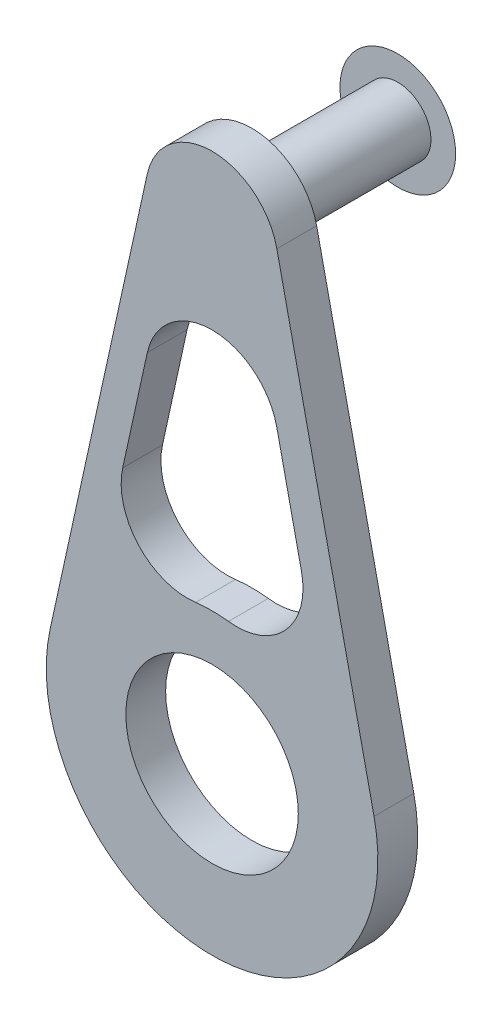
ISO-10303-21;
HEADER;
FILE_DESCRIPTION(('STEP AP214'),'2;1');
FILE_NAME('part.step','',(''),(''),'','','');
FILE_SCHEMA(('AUTOMOTIVE_DESIGN { 1 0 10303 214 1 1 1 1 }'));
ENDSEC;
DATA;
#1=APPLICATION_CONTEXT('core data for automotive mechanical design processes');
#2=APPLICATION_PROTOCOL_DEFINITION('international standard','automotive_design',2000,#1);
#3=PRODUCT_CONTEXT('',#1,'mechanical');
#4=PRODUCT('Part','Part','',(#3));
#5=PRODUCT_RELATED_PRODUCT_CATEGORY('part','',(#4));
#6=PRODUCT_DEFINITION_FORMATION('','',#4);
#7=PRODUCT_DEFINITION_CONTEXT('part definition',#1,'design');
#8=PRODUCT_DEFINITION('design','',#6,#7);
#9=PRODUCT_DEFINITION_SHAPE('','',#8);
#10=(LENGTH_UNIT() NAMED_UNIT(*) SI_UNIT(.MILLI.,.METRE.));
#11=(NAMED_UNIT(*) PLANE_ANGLE_UNIT() SI_UNIT($,.RADIAN.));
#12=(NAMED_UNIT(*) SI_UNIT($,.STERADIAN.) SOLID_ANGLE_UNIT());
#13=UNCERTAINTY_MEASURE_WITH_UNIT(LENGTH_MEASURE(1.E-05),#10,'distance_accuracy_value','');
#14=(GEOMETRIC_REPRESENTATION_CONTEXT(3) GLOBAL_UNCERTAINTY_ASSIGNED_CONTEXT((#13)) GLOBAL_UNIT_ASSIGNED_CONTEXT((#10,
#11,#12)) REPRESENTATION_CONTEXT('',''));
#15=CARTESIAN_POINT('',(0.,0.,0.));
#16=DIRECTION('',(0.,0.,1.));
#17=DIRECTION('',(1.,0.,0.));
#18=AXIS2_PLACEMENT_3D('',#15,#16,#17);
#19=CARTESIAN_POINT('',(0.,0.,11.));
#20=DIRECTION('',(0.,0.,-1.));
#21=DIRECTION('',(-1.,0.,0.));
#22=AXIS2_PLACEMENT_3D('',#19,#20,#21);
#23=CYLINDRICAL_SURFACE('',#22,2.5);
#24=CARTESIAN_POINT('',(0.,0.,11.));
#25=DIRECTION('',(0.,0.,1.));
#26=DIRECTION('',(1.,0.,0.));
#27=AXIS2_PLACEMENT_3D('',#24,#25,#26);
#28=CIRCLE('',#27,2.5);
#29=CARTESIAN_POINT('',(2.5,0.,11.));
#30=VERTEX_POINT('',#29);
#31=EDGE_CURVE('E188',#30,#30,#28,.T.);
#32=ORIENTED_EDGE('',*,*,#31,.F.);
#33=EDGE_LOOP('',(#32));
#34=FACE_BOUND('',#33,.T.);
#35=CARTESIAN_POINT('',(0.,0.,0.));
#36=DIRECTION('',(0.,0.,-1.));
#37=DIRECTION('',(-1.,0.,0.));
#38=AXIS2_PLACEMENT_3D('',#35,#36,#37);
#39=CIRCLE('',#38,2.5);
#40=CARTESIAN_POINT('',(-2.5,0.,0.));
#41=VERTEX_POINT('',#40);
#42=EDGE_CURVE('E185',#41,#41,#39,.T.);
#43=ORIENTED_EDGE('',*,*,#42,.F.);
#44=EDGE_LOOP('',(#43));
#45=FACE_BOUND('',#44,.T.);
#46=ADVANCED_FACE('F41',(#34,#45),#23,.T.);
#47=CARTESIAN_POINT('',(0.,0.,9.));
#48=DIRECTION('',(0.,0.,1.));
#49=DIRECTION('',(1.,0.,0.));
#50=AXIS2_PLACEMENT_3D('',#47,#48,#49);
#51=SPHERICAL_SURFACE('',#50,10.);
#52=CARTESIAN_POINT('',(0.,0.,0.));
#53=DIRECTION('',(0.,0.,1.));
#54=DIRECTION('',(1.,0.,0.));
#55=AXIS2_PLACEMENT_3D('',#52,#53,#54);
#56=CIRCLE('',#55,4.35889894354068);
#57=CARTESIAN_POINT('',(4.35889894354068,0.,0.));
#58=VERTEX_POINT('',#57);
#59=EDGE_CURVE('E182',#58,#58,#56,.T.);
#60=ORIENTED_EDGE('',*,*,#59,.F.);
#61=EDGE_LOOP('',(#60));
#62=FACE_BOUND('',#61,.T.);
#63=ADVANCED_FACE('F239',(#62),#51,.T.);
#64=CARTESIAN_POINT('',(0.,0.,0.));
#65=DIRECTION('',(0.,0.,-1.));
#66=DIRECTION('',(-1.,0.,0.));
#67=AXIS2_PLACEMENT_3D('',#64,#65,#66);
#68=PLANE('',#67);
#69=ORIENTED_EDGE('',*,*,#42,.T.);
#70=EDGE_LOOP('',(#69));
#71=FACE_BOUND('',#70,.T.);
#72=ORIENTED_EDGE('',*,*,#59,.T.);
#73=EDGE_LOOP('',(#72));
#74=FACE_BOUND('',#73,.T.);
#75=ADVANCED_FACE('F228',(#71,#74),#68,.F.);
#76=CARTESIAN_POINT('',(0.,0.,14.));
#77=DIRECTION('',(0.,0.,1.));
#78=DIRECTION('',(1.,0.,0.));
#79=AXIS2_PLACEMENT_3D('',#76,#77,#78);
#80=PLANE('',#79);
#81=CARTESIAN_POINT('',(0.,0.,14.));
#82=DIRECTION('',(0.,0.,1.));
#83=DIRECTION('',(1.,0.,0.));
#84=AXIS2_PLACEMENT_3D('',#81,#82,#83);
#85=CIRCLE('',#84,4.99999999999999);
#86=CARTESIAN_POINT('',(4.88385511827761,1.07142857142857,14.));
#87=VERTEX_POINT('',#86);
#88=CARTESIAN_POINT('',(-4.88385511827762,1.07142857142857,14.));
#89=VERTEX_POINT('',#88);
#90=EDGE_CURVE('E153',#87,#89,#85,.T.);
#91=ORIENTED_EDGE('',*,*,#90,.T.);
#92=DIRECTION('',(-0.214285714285714,-0.976771023655524,0.));
#93=VECTOR('',#92,1.);
#94=CARTESIAN_POINT('',(-4.88385511827762,1.07142857142857,14.));
#95=LINE('',#94,#93);
#96=CARTESIAN_POINT('',(-12.2096377956941,-32.3214285714286,14.));
#97=VERTEX_POINT('',#96);
#98=EDGE_CURVE('E156',#89,#97,#95,.T.);
#99=ORIENTED_EDGE('',*,*,#98,.T.);
#100=CARTESIAN_POINT('',(0.,-34.9999999999983,14.));
#101=DIRECTION('',(0.,0.,1.));
#102=DIRECTION('',(1.,0.,0.));
#103=AXIS2_PLACEMENT_3D('',#100,#101,#102);
#104=CIRCLE('',#103,12.4999999999997);
#105=CARTESIAN_POINT('',(12.2096377956942,-32.3214285714286,14.));
#106=VERTEX_POINT('',#105);
#107=EDGE_CURVE('E159',#97,#106,#104,.T.);
#108=ORIENTED_EDGE('',*,*,#107,.T.);
#109=DIRECTION('',(-0.214285714285721,0.976771023655523,0.));
#110=VECTOR('',#109,1.);
#111=CARTESIAN_POINT('',(4.88385511827761,1.07142857142857,14.));
#112=LINE('',#111,#110);
#113=EDGE_CURVE('E161',#106,#87,#112,.T.);
#114=ORIENTED_EDGE('',*,*,#113,.T.);
#115=EDGE_LOOP('',(#91,#99,#108,#114));
#116=FACE_BOUND('',#115,.T.);
#117=DIRECTION('',(-0.21428571428572,0.976771023655523,0.));
#118=VECTOR('',#117,1.);
#119=CARTESIAN_POINT('',(9.76771023655547,-32.8571428571429,14.));
#120=LINE('',#119,#118);
#121=CARTESIAN_POINT('',(6.73725260289842,-19.0435145672744,14.));
#122=VERTEX_POINT('',#121);
#123=CARTESIAN_POINT('',(4.88385511827767,-10.5952380952381,14.));
#124=VERTEX_POINT('',#123);
#125=EDGE_CURVE('E118',#122,#124,#120,.T.);
#126=ORIENTED_EDGE('',*,*,#125,.F.);
#127=CARTESIAN_POINT('',(1.8533974846208,-20.114943138703,14.));
#128=DIRECTION('',(0.,0.,1.));
#129=DIRECTION('',(1.,0.,0.));
#130=AXIS2_PLACEMENT_3D('',#127,#128,#129);
#131=CIRCLE('',#130,5.);
#132=CARTESIAN_POINT('',(1.23559832308054,-25.0766287591349,14.));
#133=VERTEX_POINT('',#132);
#134=EDGE_CURVE('E201',#122,#133,#131,.F.);
#135=ORIENTED_EDGE('',*,*,#134,.T.);
#136=CARTESIAN_POINT('',(0.,-34.9999999999983,14.));
#137=DIRECTION('',(0.,0.,1.));
#138=DIRECTION('',(1.,0.,0.));
#139=AXIS2_PLACEMENT_3D('',#136,#137,#138);
#140=CIRCLE('',#139,9.99999999999974);
#141=CARTESIAN_POINT('',(-1.23559832308041,-25.0766287591349,14.));
#142=VERTEX_POINT('',#141);
#143=EDGE_CURVE('E218',#133,#142,#140,.T.);
#144=ORIENTED_EDGE('',*,*,#143,.T.);
#145=CARTESIAN_POINT('',(-1.85339748462067,-20.114943138703,14.));
#146=DIRECTION('',(0.,0.,1.));
#147=DIRECTION('',(1.,0.,0.));
#148=AXIS2_PLACEMENT_3D('',#145,#146,#147);
#149=CIRCLE('',#148,5.);
#150=CARTESIAN_POINT('',(-6.73725260289829,-19.0435145672744,14.));
#151=VERTEX_POINT('',#150);
#152=EDGE_CURVE('E11',#142,#151,#149,.F.);
#153=ORIENTED_EDGE('',*,*,#152,.T.);
#154=DIRECTION('',(-0.214285714285714,-0.976771023655525,0.));
#155=VECTOR('',#154,1.);
#156=CARTESIAN_POINT('',(-9.76771023655524,-32.8571428571429,14.));
#157=LINE('',#156,#155);
#158=CARTESIAN_POINT('',(-4.88385511827764,-10.5952380952381,14.));
#159=VERTEX_POINT('',#158);
#160=EDGE_CURVE('E141',#159,#151,#157,.T.);
#161=ORIENTED_EDGE('',*,*,#160,.F.);
#162=CARTESIAN_POINT('',(0.,-11.6666666666667,14.));
#163=DIRECTION('',(0.,0.,1.));
#164=DIRECTION('',(1.,0.,0.));
#165=AXIS2_PLACEMENT_3D('',#162,#163,#164);
#166=CIRCLE('',#165,5.00000000000005);
#167=EDGE_CURVE('E128',#124,#159,#166,.T.);
#168=ORIENTED_EDGE('',*,*,#167,.F.);
#169=EDGE_LOOP('',(#126,#135,#144,#153,#161,#168));
#170=FACE_BOUND('',#169,.T.);
#171=CARTESIAN_POINT('',(0.,-34.9999999999983,14.));
#172=DIRECTION('',(0.,0.,1.));
#173=DIRECTION('',(1.,0.,0.));
#174=AXIS2_PLACEMENT_3D('',#171,#172,#173);
#175=CIRCLE('',#174,6.5);
#176=CARTESIAN_POINT('',(6.50000000000006,-34.9999999999983,14.));
#177=VERTEX_POINT('',#176);
#178=EDGE_CURVE('E219',#177,#177,#175,.T.);
#179=ORIENTED_EDGE('',*,*,#178,.F.);
#180=EDGE_LOOP('',(#179));
#181=FACE_BOUND('',#180,.T.);
#182=ADVANCED_FACE('F139',(#116,#170,#181),#80,.T.);
#183=CARTESIAN_POINT('',(0.,0.,11.));
#184=DIRECTION('',(0.,0.,1.));
#185=DIRECTION('',(1.,0.,0.));
#186=AXIS2_PLACEMENT_3D('',#183,#184,#185);
#187=PLANE('',#186);
#188=ORIENTED_EDGE('',*,*,#31,.T.);
#189=EDGE_LOOP('',(#188));
#190=FACE_BOUND('',#189,.T.);
#191=CARTESIAN_POINT('',(0.,0.,11.));
#192=DIRECTION('',(0.,0.,1.));
#193=DIRECTION('',(1.,0.,0.));
#194=AXIS2_PLACEMENT_3D('',#191,#192,#193);
#195=CIRCLE('',#194,4.99999999999999);
#196=CARTESIAN_POINT('',(4.88385511827761,1.07142857142857,11.));
#197=VERTEX_POINT('',#196);
#198=CARTESIAN_POINT('',(-4.88385511827762,1.07142857142857,11.));
#199=VERTEX_POINT('',#198);
#200=EDGE_CURVE('E136',#197,#199,#195,.T.);
#201=ORIENTED_EDGE('',*,*,#200,.F.);
#202=DIRECTION('',(-0.214285714285721,0.976771023655523,0.));
#203=VECTOR('',#202,1.);
#204=CARTESIAN_POINT('',(4.88385511827761,1.07142857142857,11.));
#205=LINE('',#204,#203);
#206=CARTESIAN_POINT('',(12.2096377956942,-32.3214285714286,11.));
#207=VERTEX_POINT('',#206);
#208=EDGE_CURVE('E157',#207,#197,#205,.T.);
#209=ORIENTED_EDGE('',*,*,#208,.F.);
#210=CARTESIAN_POINT('',(0.,-34.9999999999983,11.));
#211=DIRECTION('',(0.,0.,1.));
#212=DIRECTION('',(1.,0.,0.));
#213=AXIS2_PLACEMENT_3D('',#210,#211,#212);
#214=CIRCLE('',#213,12.4999999999997);
#215=CARTESIAN_POINT('',(-12.2096377956941,-32.3214285714286,11.));
#216=VERTEX_POINT('',#215);
#217=EDGE_CURVE('E168',#216,#207,#214,.T.);
#218=ORIENTED_EDGE('',*,*,#217,.F.);
#219=DIRECTION('',(-0.214285714285714,-0.976771023655524,0.));
#220=VECTOR('',#219,1.);
#221=CARTESIAN_POINT('',(-4.88385511827762,1.07142857142857,11.));
#222=LINE('',#221,#220);
#223=EDGE_CURVE('E166',#199,#216,#222,.T.);
#224=ORIENTED_EDGE('',*,*,#223,.F.);
#225=EDGE_LOOP('',(#201,#209,#218,#224));
#226=FACE_BOUND('',#225,.T.);
#227=DIRECTION('',(-0.214285714285714,-0.976771023655525,0.));
#228=VECTOR('',#227,1.);
#229=CARTESIAN_POINT('',(-9.76771023655524,-32.8571428571429,11.));
#230=LINE('',#229,#228);
#231=CARTESIAN_POINT('',(-4.88385511827764,-10.5952380952381,11.));
#232=VERTEX_POINT('',#231);
#233=CARTESIAN_POINT('',(-6.73725260289829,-19.0435145672744,11.));
#234=VERTEX_POINT('',#233);
#235=EDGE_CURVE('E129',#232,#234,#230,.T.);
#236=ORIENTED_EDGE('',*,*,#235,.T.);
#237=CARTESIAN_POINT('',(-1.85339748462067,-20.114943138703,11.));
#238=DIRECTION('',(0.,0.,1.));
#239=DIRECTION('',(1.,0.,0.));
#240=AXIS2_PLACEMENT_3D('',#237,#238,#239);
#241=CIRCLE('',#240,5.);
#242=CARTESIAN_POINT('',(-1.23559832308041,-25.0766287591349,11.));
#243=VERTEX_POINT('',#242);
#244=EDGE_CURVE('E49',#234,#243,#241,.T.);
#245=ORIENTED_EDGE('',*,*,#244,.T.);
#246=CARTESIAN_POINT('',(0.,-34.9999999999983,11.));
#247=DIRECTION('',(0.,0.,1.));
#248=DIRECTION('',(1.,0.,0.));
#249=AXIS2_PLACEMENT_3D('',#246,#247,#248);
#250=CIRCLE('',#249,9.99999999999974);
#251=CARTESIAN_POINT('',(1.23559832308054,-25.0766287591349,11.));
#252=VERTEX_POINT('',#251);
#253=EDGE_CURVE('E148',#243,#252,#250,.F.);
#254=ORIENTED_EDGE('',*,*,#253,.T.);
#255=CARTESIAN_POINT('',(1.8533974846208,-20.114943138703,11.));
#256=DIRECTION('',(0.,0.,1.));
#257=DIRECTION('',(1.,0.,0.));
#258=AXIS2_PLACEMENT_3D('',#255,#256,#257);
#259=CIRCLE('',#258,5.);
#260=CARTESIAN_POINT('',(6.73725260289842,-19.0435145672744,11.));
#261=VERTEX_POINT('',#260);
#262=EDGE_CURVE('E199',#252,#261,#259,.T.);
#263=ORIENTED_EDGE('',*,*,#262,.T.);
#264=DIRECTION('',(-0.21428571428572,0.976771023655523,0.));
#265=VECTOR('',#264,1.);
#266=CARTESIAN_POINT('',(9.76771023655547,-32.8571428571429,11.));
#267=LINE('',#266,#265);
#268=CARTESIAN_POINT('',(4.88385511827767,-10.5952380952381,11.));
#269=VERTEX_POINT('',#268);
#270=EDGE_CURVE('E146',#261,#269,#267,.T.);
#271=ORIENTED_EDGE('',*,*,#270,.T.);
#272=CARTESIAN_POINT('',(0.,-11.6666666666667,11.));
#273=DIRECTION('',(0.,0.,1.));
#274=DIRECTION('',(1.,0.,0.));
#275=AXIS2_PLACEMENT_3D('',#272,#273,#274);
#276=CIRCLE('',#275,5.00000000000005);
#277=EDGE_CURVE('E135',#269,#232,#276,.T.);
#278=ORIENTED_EDGE('',*,*,#277,.T.);
#279=EDGE_LOOP('',(#236,#245,#254,#263,#271,#278));
#280=FACE_BOUND('',#279,.T.);
#281=CARTESIAN_POINT('',(0.,-34.9999999999983,11.));
#282=DIRECTION('',(0.,0.,1.));
#283=DIRECTION('',(1.,0.,0.));
#284=AXIS2_PLACEMENT_3D('',#281,#282,#283);
#285=CIRCLE('',#284,6.5);
#286=CARTESIAN_POINT('',(6.50000000000006,-34.9999999999983,11.));
#287=VERTEX_POINT('',#286);
#288=EDGE_CURVE('E212',#287,#287,#285,.F.);
#289=ORIENTED_EDGE('',*,*,#288,.F.);
#290=EDGE_LOOP('',(#289));
#291=FACE_BOUND('',#290,.T.);
#292=ADVANCED_FACE('F205',(#190,#226,#280,#291),#187,.F.);
#293=CARTESIAN_POINT('',(0.,0.,14.));
#294=DIRECTION('',(0.,0.,-1.));
#295=DIRECTION('',(-1.,0.,0.));
#296=AXIS2_PLACEMENT_3D('',#293,#294,#295);
#297=CYLINDRICAL_SURFACE('',#296,4.99999999999999);
#298=ORIENTED_EDGE('',*,*,#200,.T.);
#299=DIRECTION('',(0.,0.,-1.));
#300=VECTOR('',#299,1.);
#301=CARTESIAN_POINT('',(-4.88385511827762,1.07142857142857,14.));
#302=LINE('',#301,#300);
#303=EDGE_CURVE('E179',#89,#199,#302,.T.);
#304=ORIENTED_EDGE('',*,*,#303,.F.);
#305=ORIENTED_EDGE('',*,*,#90,.F.);
#306=DIRECTION('',(0.,0.,-1.));
#307=VECTOR('',#306,1.);
#308=CARTESIAN_POINT('',(4.88385511827761,1.07142857142857,14.));
#309=LINE('',#308,#307);
#310=EDGE_CURVE('E163',#87,#197,#309,.T.);
#311=ORIENTED_EDGE('',*,*,#310,.T.);
#312=EDGE_LOOP('',(#298,#304,#305,#311));
#313=FACE_BOUND('',#312,.T.);
#314=ADVANCED_FACE('F235',(#313),#297,.T.);
#315=CARTESIAN_POINT('',(-4.88385511827762,1.07142857142857,14.));
#316=DIRECTION('',(0.976771023655524,-0.214285714285714,0.));
#317=DIRECTION('',(0.214285714285714,0.976771023655525,0.));
#318=AXIS2_PLACEMENT_3D('',#315,#316,#317);
#319=PLANE('',#318);
#320=ORIENTED_EDGE('',*,*,#223,.T.);
#321=DIRECTION('',(0.,0.,-1.));
#322=VECTOR('',#321,1.);
#323=CARTESIAN_POINT('',(-12.2096377956941,-32.3214285714286,14.));
#324=LINE('',#323,#322);
#325=EDGE_CURVE('E176',#97,#216,#324,.T.);
#326=ORIENTED_EDGE('',*,*,#325,.F.);
#327=ORIENTED_EDGE('',*,*,#98,.F.);
#328=ORIENTED_EDGE('',*,*,#303,.T.);
#329=EDGE_LOOP('',(#320,#326,#327,#328));
#330=FACE_BOUND('',#329,.T.);
#331=ADVANCED_FACE('F280',(#330),#319,.F.);
#332=CARTESIAN_POINT('',(0.,-34.9999999999983,14.));
#333=DIRECTION('',(0.,0.,-1.));
#334=DIRECTION('',(-1.,0.,0.));
#335=AXIS2_PLACEMENT_3D('',#332,#333,#334);
#336=CYLINDRICAL_SURFACE('',#335,12.4999999999997);
#337=ORIENTED_EDGE('',*,*,#217,.T.);
#338=DIRECTION('',(0.,0.,-1.));
#339=VECTOR('',#338,1.);
#340=CARTESIAN_POINT('',(12.2096377956942,-32.3214285714286,14.));
#341=LINE('',#340,#339);
#342=EDGE_CURVE('E173',#106,#207,#341,.T.);
#343=ORIENTED_EDGE('',*,*,#342,.F.);
#344=ORIENTED_EDGE('',*,*,#107,.F.);
#345=ORIENTED_EDGE('',*,*,#325,.T.);
#346=EDGE_LOOP('',(#337,#343,#344,#345));
#347=FACE_BOUND('',#346,.T.);
#348=ADVANCED_FACE('F274',(#347),#336,.T.);
#349=CARTESIAN_POINT('',(4.88385511827761,1.07142857142857,14.));
#350=DIRECTION('',(-0.976771023655523,-0.214285714285721,0.));
#351=DIRECTION('',(0.214285714285721,-0.976771023655523,0.));
#352=AXIS2_PLACEMENT_3D('',#349,#350,#351);
#353=PLANE('',#352);
#354=ORIENTED_EDGE('',*,*,#208,.T.);
#355=ORIENTED_EDGE('',*,*,#310,.F.);
#356=ORIENTED_EDGE('',*,*,#113,.F.);
#357=ORIENTED_EDGE('',*,*,#342,.T.);
#358=EDGE_LOOP('',(#354,#355,#356,#357));
#359=FACE_BOUND('',#358,.T.);
#360=ADVANCED_FACE('F269',(#359),#353,.F.);
#361=CARTESIAN_POINT('',(9.76771023655547,-32.8571428571429,14.));
#362=DIRECTION('',(-0.976771023655523,-0.21428571428572,0.));
#363=DIRECTION('',(0.21428571428572,-0.976771023655523,0.));
#364=AXIS2_PLACEMENT_3D('',#361,#362,#363);
#365=PLANE('',#364);
#366=ORIENTED_EDGE('',*,*,#270,.F.);
#367=DIRECTION('',(0.,0.,-1.));
#368=VECTOR('',#367,1.);
#369=CARTESIAN_POINT('',(6.73725260289842,-19.0435145672744,14.));
#370=LINE('',#369,#368);
#371=EDGE_CURVE('E125',#261,#122,#370,.F.);
#372=ORIENTED_EDGE('',*,*,#371,.T.);
#373=ORIENTED_EDGE('',*,*,#125,.T.);
#374=DIRECTION('',(0.,0.,-1.));
#375=VECTOR('',#374,1.);
#376=CARTESIAN_POINT('',(4.88385511827767,-10.5952380952381,14.));
#377=LINE('',#376,#375);
#378=EDGE_CURVE('E122',#124,#269,#377,.T.);
#379=ORIENTED_EDGE('',*,*,#378,.T.);
#380=EDGE_LOOP('',(#366,#372,#373,#379));
#381=FACE_BOUND('',#380,.T.);
#382=ADVANCED_FACE('F121',(#381),#365,.T.);
#383=CARTESIAN_POINT('',(0.,-11.6666666666667,14.));
#384=DIRECTION('',(0.,0.,-1.));
#385=DIRECTION('',(-1.,0.,0.));
#386=AXIS2_PLACEMENT_3D('',#383,#384,#385);
#387=CYLINDRICAL_SURFACE('',#386,5.00000000000005);
#388=ORIENTED_EDGE('',*,*,#277,.F.);
#389=ORIENTED_EDGE('',*,*,#378,.F.);
#390=ORIENTED_EDGE('',*,*,#167,.T.);
#391=DIRECTION('',(0.,0.,-1.));
#392=VECTOR('',#391,1.);
#393=CARTESIAN_POINT('',(-4.88385511827764,-10.5952380952381,14.));
#394=LINE('',#393,#392);
#395=EDGE_CURVE('E137',#159,#232,#394,.T.);
#396=ORIENTED_EDGE('',*,*,#395,.T.);
#397=EDGE_LOOP('',(#388,#389,#390,#396));
#398=FACE_BOUND('',#397,.T.);
#399=ADVANCED_FACE('F133',(#398),#387,.F.);
#400=CARTESIAN_POINT('',(-9.76771023655524,-32.8571428571429,14.));
#401=DIRECTION('',(0.976771023655524,-0.214285714285714,0.));
#402=DIRECTION('',(0.214285714285714,0.976771023655525,0.));
#403=AXIS2_PLACEMENT_3D('',#400,#401,#402);
#404=PLANE('',#403);
#405=ORIENTED_EDGE('',*,*,#160,.T.);
#406=DIRECTION('',(0.,0.,-1.));
#407=VECTOR('',#406,1.);
#408=CARTESIAN_POINT('',(-6.73725260289829,-19.0435145672744,11.));
#409=LINE('',#408,#407);
#410=EDGE_CURVE('E197',#151,#234,#409,.T.);
#411=ORIENTED_EDGE('',*,*,#410,.T.);
#412=ORIENTED_EDGE('',*,*,#235,.F.);
#413=ORIENTED_EDGE('',*,*,#395,.F.);
#414=EDGE_LOOP('',(#405,#411,#412,#413));
#415=FACE_BOUND('',#414,.T.);
#416=ADVANCED_FACE('F215',(#415),#404,.T.);
#417=CARTESIAN_POINT('',(0.,-34.9999999999983,-17.2842712474612));
#418=DIRECTION('',(0.,0.,1.));
#419=DIRECTION('',(1.,0.,0.));
#420=AXIS2_PLACEMENT_3D('',#417,#418,#419);
#421=CYLINDRICAL_SURFACE('',#420,9.99999999999974);
#422=ORIENTED_EDGE('',*,*,#143,.F.);
#423=DIRECTION('',(0.,0.,1.));
#424=VECTOR('',#423,1.);
#425=CARTESIAN_POINT('',(1.23559832308054,-25.0766287591349,-17.2842712474612));
#426=LINE('',#425,#424);
#427=EDGE_CURVE('E193',#133,#252,#426,.F.);
#428=ORIENTED_EDGE('',*,*,#427,.T.);
#429=ORIENTED_EDGE('',*,*,#253,.F.);
#430=DIRECTION('',(0.,0.,1.));
#431=VECTOR('',#430,1.);
#432=CARTESIAN_POINT('',(-1.23559832308041,-25.0766287591349,-17.2842712474612));
#433=LINE('',#432,#431);
#434=EDGE_CURVE('E191',#243,#142,#433,.T.);
#435=ORIENTED_EDGE('',*,*,#434,.T.);
#436=EDGE_LOOP('',(#422,#428,#429,#435));
#437=FACE_BOUND('',#436,.T.);
#438=ADVANCED_FACE('F210',(#437),#421,.T.);
#439=CARTESIAN_POINT('',(0.,-34.9999999999983,-17.2842712474612));
#440=DIRECTION('',(0.,0.,1.));
#441=DIRECTION('',(1.,0.,0.));
#442=AXIS2_PLACEMENT_3D('',#439,#440,#441);
#443=CYLINDRICAL_SURFACE('',#442,6.5);
#444=ORIENTED_EDGE('',*,*,#288,.T.);
#445=EDGE_LOOP('',(#444));
#446=FACE_BOUND('',#445,.T.);
#447=ORIENTED_EDGE('',*,*,#178,.T.);
#448=EDGE_LOOP('',(#447));
#449=FACE_BOUND('',#448,.T.);
#450=ADVANCED_FACE('F226',(#446,#449),#443,.F.);
#451=CARTESIAN_POINT('',(1.8533974846208,-20.114943138703,-17.2842712474612));
#452=DIRECTION('',(0.,0.,1.));
#453=DIRECTION('',(1.,0.,0.));
#454=AXIS2_PLACEMENT_3D('',#451,#452,#453);
#455=CYLINDRICAL_SURFACE('',#454,5.);
#456=ORIENTED_EDGE('',*,*,#134,.F.);
#457=ORIENTED_EDGE('',*,*,#371,.F.);
#458=ORIENTED_EDGE('',*,*,#262,.F.);
#459=ORIENTED_EDGE('',*,*,#427,.F.);
#460=EDGE_LOOP('',(#456,#457,#458,#459));
#461=FACE_BOUND('',#460,.T.);
#462=ADVANCED_FACE('F217',(#461),#455,.F.);
#463=CARTESIAN_POINT('',(-1.85339748462067,-20.114943138703,-17.2842712474612));
#464=DIRECTION('',(0.,0.,1.));
#465=DIRECTION('',(1.,0.,0.));
#466=AXIS2_PLACEMENT_3D('',#463,#464,#465);
#467=CYLINDRICAL_SURFACE('',#466,5.);
#468=ORIENTED_EDGE('',*,*,#152,.F.);
#469=ORIENTED_EDGE('',*,*,#434,.F.);
#470=ORIENTED_EDGE('',*,*,#244,.F.);
#471=ORIENTED_EDGE('',*,*,#410,.F.);
#472=EDGE_LOOP('',(#468,#469,#470,#471));
#473=FACE_BOUND('',#472,.T.);
#474=ADVANCED_FACE('F43',(#473),#467,.F.);
#475=CLOSED_SHELL('',(#46,#63,#75,#182,#292,#314,#331,#348,#360,#382,#399,#416,#438,#450,#462,#474));
#476=MANIFOLD_SOLID_BREP('B2',#475);
#477=ADVANCED_BREP_SHAPE_REPRESENTATION('',(#18,#476),#14);
#478=SHAPE_DEFINITION_REPRESENTATION(#9,#477);
ENDSEC;
END-ISO-10303-21;
